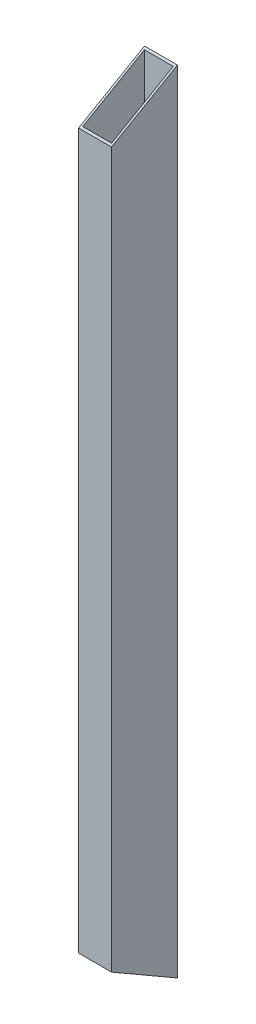
ISO-10303-21;
HEADER;
FILE_DESCRIPTION(('STEP AP214'),'2;1');
FILE_NAME('part.step','',(''),(''),'','','');
FILE_SCHEMA(('AUTOMOTIVE_DESIGN { 1 0 10303 214 1 1 1 1 }'));
ENDSEC;
DATA;
#1=APPLICATION_CONTEXT('core data for automotive mechanical design processes');
#2=APPLICATION_PROTOCOL_DEFINITION('international standard','automotive_design',2000,#1);
#3=PRODUCT_CONTEXT('',#1,'mechanical');
#4=PRODUCT('Part','Part','',(#3));
#5=PRODUCT_RELATED_PRODUCT_CATEGORY('part','',(#4));
#6=PRODUCT_DEFINITION_FORMATION('','',#4);
#7=PRODUCT_DEFINITION_CONTEXT('part definition',#1,'design');
#8=PRODUCT_DEFINITION('design','',#6,#7);
#9=PRODUCT_DEFINITION_SHAPE('','',#8);
#10=(LENGTH_UNIT() NAMED_UNIT(*) SI_UNIT(.MILLI.,.METRE.));
#11=(NAMED_UNIT(*) PLANE_ANGLE_UNIT() SI_UNIT($,.RADIAN.));
#12=(NAMED_UNIT(*) SI_UNIT($,.STERADIAN.) SOLID_ANGLE_UNIT());
#13=UNCERTAINTY_MEASURE_WITH_UNIT(LENGTH_MEASURE(1.E-05),#10,'distance_accuracy_value','');
#14=(GEOMETRIC_REPRESENTATION_CONTEXT(3) GLOBAL_UNCERTAINTY_ASSIGNED_CONTEXT((#13)) GLOBAL_UNIT_ASSIGNED_CONTEXT((#10,
#11,#12)) REPRESENTATION_CONTEXT('',''));
#15=CARTESIAN_POINT('',(0.,0.,0.));
#16=DIRECTION('',(0.,0.,1.));
#17=DIRECTION('',(1.,0.,0.));
#18=AXIS2_PLACEMENT_3D('',#15,#16,#17);
#19=CARTESIAN_POINT('',(-12.7,609.6,25.4));
#20=DIRECTION('',(1.,0.,0.));
#21=DIRECTION('',(0.,0.,-1.));
#22=AXIS2_PLACEMENT_3D('',#19,#20,#21);
#23=PLANE('',#22);
#24=DIRECTION('',(0.,-1.,0.));
#25=VECTOR('',#24,1.);
#26=CARTESIAN_POINT('',(-12.7,609.6,-25.4));
#27=LINE('',#26,#25);
#28=CARTESIAN_POINT('',(-12.7,609.6,-25.4));
#29=VERTEX_POINT('',#28);
#30=CARTESIAN_POINT('',(-12.7,0.,-25.4));
#31=VERTEX_POINT('',#30);
#32=EDGE_CURVE('E134',#29,#31,#27,.T.);
#33=ORIENTED_EDGE('',*,*,#32,.T.);
#34=DIRECTION('',(0.,0.499999999999994,0.866025403784442));
#35=VECTOR('',#34,1.);
#36=CARTESIAN_POINT('',(-12.7,0.,-25.4));
#37=LINE('',#36,#35);
#38=CARTESIAN_POINT('',(-12.7,29.3293936748326,25.4));
#39=VERTEX_POINT('',#38);
#40=EDGE_CURVE('E113',#31,#39,#37,.T.);
#41=ORIENTED_EDGE('',*,*,#40,.T.);
#42=DIRECTION('',(0.,-1.,0.));
#43=VECTOR('',#42,1.);
#44=CARTESIAN_POINT('',(-12.7,609.6,25.4));
#45=LINE('',#44,#43);
#46=CARTESIAN_POINT('',(-12.7,580.270606325167,25.4));
#47=VERTEX_POINT('',#46);
#48=EDGE_CURVE('E122',#47,#39,#45,.T.);
#49=ORIENTED_EDGE('',*,*,#48,.F.);
#50=DIRECTION('',(0.,0.499999999999996,-0.866025403784441));
#51=VECTOR('',#50,1.);
#52=CARTESIAN_POINT('',(-12.7,580.270606325167,25.4));
#53=LINE('',#52,#51);
#54=EDGE_CURVE('E181',#47,#29,#53,.T.);
#55=ORIENTED_EDGE('',*,*,#54,.T.);
#56=EDGE_LOOP('',(#33,#41,#49,#55));
#57=FACE_BOUND('',#56,.T.);
#58=ADVANCED_FACE('F38',(#57),#23,.F.);
#59=CARTESIAN_POINT('',(12.7,609.6,25.4));
#60=DIRECTION('',(0.,0.,-1.));
#61=DIRECTION('',(-1.,0.,0.));
#62=AXIS2_PLACEMENT_3D('',#59,#60,#61);
#63=PLANE('',#62);
#64=ORIENTED_EDGE('',*,*,#48,.T.);
#65=DIRECTION('',(1.,0.,0.));
#66=VECTOR('',#65,1.);
#67=CARTESIAN_POINT('',(-12.7,29.3293936748326,25.4));
#68=LINE('',#67,#66);
#69=CARTESIAN_POINT('',(12.7,29.3293936748326,25.4));
#70=VERTEX_POINT('',#69);
#71=EDGE_CURVE('E104',#39,#70,#68,.T.);
#72=ORIENTED_EDGE('',*,*,#71,.T.);
#73=DIRECTION('',(0.,-1.,0.));
#74=VECTOR('',#73,1.);
#75=CARTESIAN_POINT('',(12.7,609.6,25.4));
#76=LINE('',#75,#74);
#77=CARTESIAN_POINT('',(12.7,580.270606325167,25.4));
#78=VERTEX_POINT('',#77);
#79=EDGE_CURVE('E120',#78,#70,#76,.T.);
#80=ORIENTED_EDGE('',*,*,#79,.F.);
#81=DIRECTION('',(1.,0.,0.));
#82=VECTOR('',#81,1.);
#83=CARTESIAN_POINT('',(-12.7,580.270606325167,25.4));
#84=LINE('',#83,#82);
#85=EDGE_CURVE('E156',#47,#78,#84,.T.);
#86=ORIENTED_EDGE('',*,*,#85,.F.);
#87=EDGE_LOOP('',(#64,#72,#80,#86));
#88=FACE_BOUND('',#87,.T.);
#89=ADVANCED_FACE('F118',(#88),#63,.F.);
#90=CARTESIAN_POINT('',(12.7,609.6,25.4));
#91=DIRECTION('',(-1.,0.,0.));
#92=DIRECTION('',(0.,0.,1.));
#93=AXIS2_PLACEMENT_3D('',#90,#91,#92);
#94=PLANE('',#93);
#95=ORIENTED_EDGE('',*,*,#79,.T.);
#96=DIRECTION('',(0.,0.499999999999994,0.866025403784442));
#97=VECTOR('',#96,1.);
#98=CARTESIAN_POINT('',(12.7,0.,-25.4));
#99=LINE('',#98,#97);
#100=CARTESIAN_POINT('',(12.7,0.,-25.4));
#101=VERTEX_POINT('',#100);
#102=EDGE_CURVE('E101',#101,#70,#99,.T.);
#103=ORIENTED_EDGE('',*,*,#102,.F.);
#104=DIRECTION('',(0.,-1.,0.));
#105=VECTOR('',#104,1.);
#106=CARTESIAN_POINT('',(12.7,609.6,-25.4));
#107=LINE('',#106,#105);
#108=CARTESIAN_POINT('',(12.7,609.6,-25.4));
#109=VERTEX_POINT('',#108);
#110=EDGE_CURVE('E129',#109,#101,#107,.T.);
#111=ORIENTED_EDGE('',*,*,#110,.F.);
#112=DIRECTION('',(0.,0.499999999999996,-0.866025403784441));
#113=VECTOR('',#112,1.);
#114=CARTESIAN_POINT('',(12.7,580.270606325167,25.4));
#115=LINE('',#114,#113);
#116=EDGE_CURVE('E127',#78,#109,#115,.T.);
#117=ORIENTED_EDGE('',*,*,#116,.F.);
#118=EDGE_LOOP('',(#95,#103,#111,#117));
#119=FACE_BOUND('',#118,.T.);
#120=ADVANCED_FACE('F126',(#119),#94,.F.);
#121=CARTESIAN_POINT('',(12.7,609.6,-25.4));
#122=DIRECTION('',(0.,0.,1.));
#123=DIRECTION('',(1.,0.,0.));
#124=AXIS2_PLACEMENT_3D('',#121,#122,#123);
#125=PLANE('',#124);
#126=DIRECTION('',(-1.,0.,0.));
#127=VECTOR('',#126,1.);
#128=CARTESIAN_POINT('',(12.7,0.,-25.4));
#129=LINE('',#128,#127);
#130=EDGE_CURVE('E107',#101,#31,#129,.T.);
#131=ORIENTED_EDGE('',*,*,#130,.T.);
#132=ORIENTED_EDGE('',*,*,#32,.F.);
#133=DIRECTION('',(-1.,0.,0.));
#134=VECTOR('',#133,1.);
#135=CARTESIAN_POINT('',(12.7,609.6,-25.4));
#136=LINE('',#135,#134);
#137=EDGE_CURVE('E172',#109,#29,#136,.T.);
#138=ORIENTED_EDGE('',*,*,#137,.F.);
#139=ORIENTED_EDGE('',*,*,#110,.T.);
#140=EDGE_LOOP('',(#131,#132,#138,#139));
#141=FACE_BOUND('',#140,.T.);
#142=ADVANCED_FACE('F184',(#141),#125,.F.);
#143=CARTESIAN_POINT('',(-11.1125,609.6,23.8125));
#144=DIRECTION('',(1.,0.,0.));
#145=DIRECTION('',(0.,0.,-1.));
#146=AXIS2_PLACEMENT_3D('',#143,#144,#145);
#147=PLANE('',#146);
#148=DIRECTION('',(0.,0.499999999999995,0.866025403784442));
#149=VECTOR('',#148,1.);
#150=CARTESIAN_POINT('',(-11.1125,173.709637591867,275.473918073495));
#151=LINE('',#150,#149);
#152=CARTESIAN_POINT('',(-11.1125,0.916543552338611,-23.8125));
#153=VERTEX_POINT('',#152);
#154=CARTESIAN_POINT('',(-11.1125,28.4128501224941,23.8125));
#155=VERTEX_POINT('',#154);
#156=EDGE_CURVE('E186',#153,#155,#151,.T.);
#157=ORIENTED_EDGE('',*,*,#156,.F.);
#158=DIRECTION('',(0.,-1.,0.));
#159=VECTOR('',#158,1.);
#160=CARTESIAN_POINT('',(-11.1125,609.6,-23.8125));
#161=LINE('',#160,#159);
#162=CARTESIAN_POINT('',(-11.1125,608.683456447662,-23.8125));
#163=VERTEX_POINT('',#162);
#164=EDGE_CURVE('E160',#163,#153,#161,.T.);
#165=ORIENTED_EDGE('',*,*,#164,.F.);
#166=DIRECTION('',(0.,0.499999999999996,-0.866025403784441));
#167=VECTOR('',#166,1.);
#168=CARTESIAN_POINT('',(-11.1125,588.290362408129,11.5093750000002));
#169=LINE('',#168,#167);
#170=CARTESIAN_POINT('',(-11.1125,581.187149877506,23.8125));
#171=VERTEX_POINT('',#170);
#172=EDGE_CURVE('E60',#171,#163,#169,.T.);
#173=ORIENTED_EDGE('',*,*,#172,.F.);
#174=DIRECTION('',(0.,-1.,0.));
#175=VECTOR('',#174,1.);
#176=CARTESIAN_POINT('',(-11.1125,609.6,23.8125));
#177=LINE('',#176,#175);
#178=EDGE_CURVE('E164',#171,#155,#177,.T.);
#179=ORIENTED_EDGE('',*,*,#178,.T.);
#180=EDGE_LOOP('',(#157,#165,#173,#179));
#181=FACE_BOUND('',#180,.T.);
#182=ADVANCED_FACE('F202',(#181),#147,.T.);
#183=CARTESIAN_POINT('',(11.1125,609.6,23.8125));
#184=DIRECTION('',(0.,0.,-1.));
#185=DIRECTION('',(-1.,0.,0.));
#186=AXIS2_PLACEMENT_3D('',#183,#184,#185);
#187=PLANE('',#186);
#188=DIRECTION('',(1.,0.,0.));
#189=VECTOR('',#188,1.);
#190=CARTESIAN_POINT('',(11.1124999999999,28.4128501224941,23.8125));
#191=LINE('',#190,#189);
#192=CARTESIAN_POINT('',(11.1125,28.4128501224941,23.8125));
#193=VERTEX_POINT('',#192);
#194=EDGE_CURVE('E191',#155,#193,#191,.T.);
#195=ORIENTED_EDGE('',*,*,#194,.F.);
#196=ORIENTED_EDGE('',*,*,#178,.F.);
#197=DIRECTION('',(-1.,0.,0.));
#198=VECTOR('',#197,1.);
#199=CARTESIAN_POINT('',(11.1125,581.187149877506,23.8125));
#200=LINE('',#199,#198);
#201=CARTESIAN_POINT('',(11.1125,581.187149877506,23.8125));
#202=VERTEX_POINT('',#201);
#203=EDGE_CURVE('E155',#202,#171,#200,.T.);
#204=ORIENTED_EDGE('',*,*,#203,.F.);
#205=DIRECTION('',(0.,-1.,0.));
#206=VECTOR('',#205,1.);
#207=CARTESIAN_POINT('',(11.1125,609.6,23.8125));
#208=LINE('',#207,#206);
#209=EDGE_CURVE('E153',#202,#193,#208,.T.);
#210=ORIENTED_EDGE('',*,*,#209,.T.);
#211=EDGE_LOOP('',(#195,#196,#204,#210));
#212=FACE_BOUND('',#211,.T.);
#213=ADVANCED_FACE('F204',(#212),#187,.T.);
#214=CARTESIAN_POINT('',(11.1125,609.6,23.8125));
#215=DIRECTION('',(-1.,0.,0.));
#216=DIRECTION('',(0.,0.,1.));
#217=AXIS2_PLACEMENT_3D('',#214,#215,#216);
#218=PLANE('',#217);
#219=DIRECTION('',(0.,-0.499999999999995,-0.866025403784442));
#220=VECTOR('',#219,1.);
#221=CARTESIAN_POINT('',(11.1125,173.709637591867,275.473918073495));
#222=LINE('',#221,#220);
#223=CARTESIAN_POINT('',(11.1125,0.916543552338833,-23.8125));
#224=VERTEX_POINT('',#223);
#225=EDGE_CURVE('E52',#193,#224,#222,.T.);
#226=ORIENTED_EDGE('',*,*,#225,.F.);
#227=ORIENTED_EDGE('',*,*,#209,.F.);
#228=DIRECTION('',(0.,-0.499999999999996,0.866025403784441));
#229=VECTOR('',#228,1.);
#230=CARTESIAN_POINT('',(11.1125,588.290362408129,11.5093750000002));
#231=LINE('',#230,#229);
#232=CARTESIAN_POINT('',(11.1125,608.683456447662,-23.8125));
#233=VERTEX_POINT('',#232);
#234=EDGE_CURVE('E141',#233,#202,#231,.T.);
#235=ORIENTED_EDGE('',*,*,#234,.F.);
#236=DIRECTION('',(0.,-1.,0.));
#237=VECTOR('',#236,1.);
#238=CARTESIAN_POINT('',(11.1125,609.6,-23.8125));
#239=LINE('',#238,#237);
#240=EDGE_CURVE('E151',#233,#224,#239,.T.);
#241=ORIENTED_EDGE('',*,*,#240,.T.);
#242=EDGE_LOOP('',(#226,#227,#235,#241));
#243=FACE_BOUND('',#242,.T.);
#244=ADVANCED_FACE('F150',(#243),#218,.T.);
#245=CARTESIAN_POINT('',(11.1125,609.6,-23.8125));
#246=DIRECTION('',(0.,0.,1.));
#247=DIRECTION('',(1.,0.,0.));
#248=AXIS2_PLACEMENT_3D('',#245,#246,#247);
#249=PLANE('',#248);
#250=DIRECTION('',(-1.,0.,0.));
#251=VECTOR('',#250,1.);
#252=CARTESIAN_POINT('',(11.1125,0.916543552338611,-23.8125));
#253=LINE('',#252,#251);
#254=EDGE_CURVE('E11',#224,#153,#253,.T.);
#255=ORIENTED_EDGE('',*,*,#254,.F.);
#256=ORIENTED_EDGE('',*,*,#240,.F.);
#257=DIRECTION('',(1.,0.,0.));
#258=VECTOR('',#257,1.);
#259=CARTESIAN_POINT('',(11.1125,608.683456447662,-23.8125));
#260=LINE('',#259,#258);
#261=EDGE_CURVE('E46',#163,#233,#260,.T.);
#262=ORIENTED_EDGE('',*,*,#261,.F.);
#263=ORIENTED_EDGE('',*,*,#164,.T.);
#264=EDGE_LOOP('',(#255,#256,#262,#263));
#265=FACE_BOUND('',#264,.T.);
#266=ADVANCED_FACE('F158',(#265),#249,.T.);
#267=CARTESIAN_POINT('',(-12.7,580.270606325167,25.4));
#268=DIRECTION('',(0.,-0.866025403784441,-0.499999999999996));
#269=DIRECTION('',(0.,0.499999999999996,-0.866025403784441));
#270=AXIS2_PLACEMENT_3D('',#267,#268,#269);
#271=PLANE('',#270);
#272=ORIENTED_EDGE('',*,*,#172,.T.);
#273=ORIENTED_EDGE('',*,*,#261,.T.);
#274=ORIENTED_EDGE('',*,*,#234,.T.);
#275=ORIENTED_EDGE('',*,*,#203,.T.);
#276=EDGE_LOOP('',(#272,#273,#274,#275));
#277=FACE_BOUND('',#276,.T.);
#278=ORIENTED_EDGE('',*,*,#116,.T.);
#279=ORIENTED_EDGE('',*,*,#137,.T.);
#280=ORIENTED_EDGE('',*,*,#54,.F.);
#281=ORIENTED_EDGE('',*,*,#85,.T.);
#282=EDGE_LOOP('',(#278,#279,#280,#281));
#283=FACE_BOUND('',#282,.T.);
#284=ADVANCED_FACE('F139',(#277,#283),#271,.F.);
#285=CARTESIAN_POINT('',(-12.7,0.,-25.4));
#286=DIRECTION('',(0.,0.866025403784442,-0.499999999999995));
#287=DIRECTION('',(0.,0.499999999999995,0.866025403784442));
#288=AXIS2_PLACEMENT_3D('',#285,#286,#287);
#289=PLANE('',#288);
#290=ORIENTED_EDGE('',*,*,#156,.T.);
#291=ORIENTED_EDGE('',*,*,#194,.T.);
#292=ORIENTED_EDGE('',*,*,#225,.T.);
#293=ORIENTED_EDGE('',*,*,#254,.T.);
#294=EDGE_LOOP('',(#290,#291,#292,#293));
#295=FACE_BOUND('',#294,.T.);
#296=ORIENTED_EDGE('',*,*,#71,.F.);
#297=ORIENTED_EDGE('',*,*,#40,.F.);
#298=ORIENTED_EDGE('',*,*,#130,.F.);
#299=ORIENTED_EDGE('',*,*,#102,.T.);
#300=EDGE_LOOP('',(#296,#297,#298,#299));
#301=FACE_BOUND('',#300,.T.);
#302=ADVANCED_FACE('F103',(#295,#301),#289,.F.);
#303=CLOSED_SHELL('',(#58,#89,#120,#142,#182,#213,#244,#266,#284,#302));
#304=MANIFOLD_SOLID_BREP('B2',#303);
#305=ADVANCED_BREP_SHAPE_REPRESENTATION('',(#18,#304),#14);
#306=SHAPE_DEFINITION_REPRESENTATION(#9,#305);
ENDSEC;
END-ISO-10303-21;
